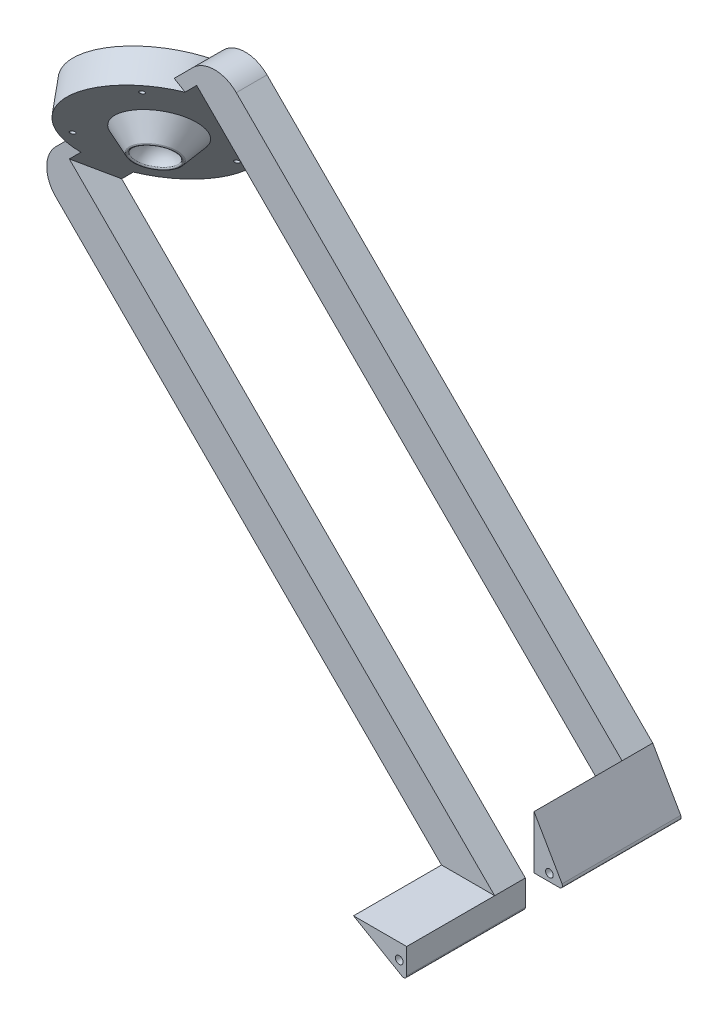
ISO-10303-21;
HEADER;
FILE_DESCRIPTION(('STEP AP214'),'2;1');
FILE_NAME('part.step','',(''),(''),'','','');
FILE_SCHEMA(('AUTOMOTIVE_DESIGN { 1 0 10303 214 1 1 1 1 }'));
ENDSEC;
DATA;
#1=APPLICATION_CONTEXT('core data for automotive mechanical design processes');
#2=APPLICATION_PROTOCOL_DEFINITION('international standard','automotive_design',2000,#1);
#3=PRODUCT_CONTEXT('',#1,'mechanical');
#4=PRODUCT('Part','Part','',(#3));
#5=PRODUCT_RELATED_PRODUCT_CATEGORY('part','',(#4));
#6=PRODUCT_DEFINITION_FORMATION('','',#4);
#7=PRODUCT_DEFINITION_CONTEXT('part definition',#1,'design');
#8=PRODUCT_DEFINITION('design','',#6,#7);
#9=PRODUCT_DEFINITION_SHAPE('','',#8);
#10=(LENGTH_UNIT() NAMED_UNIT(*) SI_UNIT(.MILLI.,.METRE.));
#11=(NAMED_UNIT(*) PLANE_ANGLE_UNIT() SI_UNIT($,.RADIAN.));
#12=(NAMED_UNIT(*) SI_UNIT($,.STERADIAN.) SOLID_ANGLE_UNIT());
#13=UNCERTAINTY_MEASURE_WITH_UNIT(LENGTH_MEASURE(1.E-05),#10,'distance_accuracy_value','');
#14=(GEOMETRIC_REPRESENTATION_CONTEXT(3) GLOBAL_UNCERTAINTY_ASSIGNED_CONTEXT((#13)) GLOBAL_UNIT_ASSIGNED_CONTEXT((#10,
#11,#12)) REPRESENTATION_CONTEXT('',''));
#15=CARTESIAN_POINT('',(0.,0.,0.));
#16=DIRECTION('',(0.,0.,1.));
#17=DIRECTION('',(1.,0.,0.));
#18=AXIS2_PLACEMENT_3D('',#15,#16,#17);
#19=CARTESIAN_POINT('',(-194.571356237309,153.071356237309,-43.6716));
#20=DIRECTION('',(0.707106781186548,-0.707106781186548,0.));
#21=DIRECTION('',(0.707106781186548,0.707106781186548,0.));
#22=AXIS2_PLACEMENT_3D('',#19,#20,#21);
#23=PLANE('',#22);
#24=DIRECTION('',(0.707106781186547,0.707106781186547,0.));
#25=VECTOR('',#24,1.);
#26=CARTESIAN_POINT('',(-194.571356237309,153.071356237309,-43.6716));
#27=LINE('',#26,#25);
#28=CARTESIAN_POINT('',(-196.160542463288,151.482170011331,-43.6716));
#29=VERTEX_POINT('',#28);
#30=CARTESIAN_POINT('',(-191.38552430756,156.257188167059,-43.6716));
#31=VERTEX_POINT('',#30);
#32=EDGE_CURVE('E283',#29,#31,#27,.T.);
#33=ORIENTED_EDGE('',*,*,#32,.F.);
#34=DIRECTION('',(0.,0.,1.));
#35=VECTOR('',#34,1.);
#36=CARTESIAN_POINT('',(-196.160542463288,151.482170011331,-43.6716));
#37=LINE('',#36,#35);
#38=CARTESIAN_POINT('',(-196.160542463288,151.482170011331,-33.6716));
#39=VERTEX_POINT('',#38);
#40=EDGE_CURVE('E361',#29,#39,#37,.T.);
#41=ORIENTED_EDGE('',*,*,#40,.T.);
#42=DIRECTION('',(0.707106781186547,0.707106781186547,0.));
#43=VECTOR('',#42,1.);
#44=CARTESIAN_POINT('',(-194.571356237309,153.071356237309,-33.6716));
#45=LINE('',#44,#43);
#46=CARTESIAN_POINT('',(-190.054039318057,157.588673156562,-33.6716));
#47=VERTEX_POINT('',#46);
#48=EDGE_CURVE('E292',#39,#47,#45,.T.);
#49=ORIENTED_EDGE('',*,*,#48,.T.);
#50=CARTESIAN_POINT('',(-173.821356237309,173.82135623731,-47.6716));
#51=DIRECTION('',(0.707106781186548,-0.707106781186548,0.));
#52=DIRECTION('',(0.,0.,1.));
#53=AXIS2_PLACEMENT_3D('',#50,#51,#52);
#54=ELLIPSE('',#53,35.3553390593275,25.);
#55=EDGE_CURVE('E226',#47,#31,#54,.T.);
#56=ORIENTED_EDGE('',*,*,#55,.T.);
#57=EDGE_LOOP('',(#33,#41,#49,#56));
#58=FACE_BOUND('',#57,.T.);
#59=ADVANCED_FACE('F41',(#58),#23,.F.);
#60=CARTESIAN_POINT('',(0.,0.,-43.6716));
#61=DIRECTION('',(0.,0.,-1.));
#62=DIRECTION('',(-1.,0.,0.));
#63=AXIS2_PLACEMENT_3D('',#60,#61,#62);
#64=PLANE('',#63);
#65=DIRECTION('',(-0.707106781186547,0.707106781186548,0.));
#66=VECTOR('',#65,1.);
#67=CARTESIAN_POINT('',(-203.231610275154,144.411102199465,-43.6716));
#68=LINE('',#67,#66);
#69=CARTESIAN_POINT('',(-70.4705080756887,11.65,-43.6716));
#70=VERTEX_POINT('',#69);
#71=CARTESIAN_POINT('',(-196.160542463288,137.3400343876,-43.6716));
#72=VERTEX_POINT('',#71);
#73=EDGE_CURVE('E279',#70,#72,#68,.T.);
#74=ORIENTED_EDGE('',*,*,#73,.T.);
#75=CARTESIAN_POINT('',(-189.089474651423,144.411102199465,-43.6716));
#76=DIRECTION('',(0.,0.,-1.));
#77=DIRECTION('',(-1.,0.,0.));
#78=AXIS2_PLACEMENT_3D('',#75,#76,#77);
#79=CIRCLE('',#78,10.);
#80=EDGE_CURVE('E11',#72,#29,#79,.T.);
#81=ORIENTED_EDGE('',*,*,#80,.T.);
#82=ORIENTED_EDGE('',*,*,#32,.T.);
#83=CARTESIAN_POINT('',(-170.992929112563,170.992929112563,-43.6716));
#84=DIRECTION('',(0.,0.,-1.));
#85=DIRECTION('',(0.707106781186548,-0.707106781186547,0.));
#86=AXIS2_PLACEMENT_3D('',#83,#84,#85);
#87=ELLIPSE('',#86,35.3553390593272,25.);
#88=CARTESIAN_POINT('',(-180.877686258511,146.966036342885,-43.6716));
#89=VERTEX_POINT('',#88);
#90=EDGE_CURVE('E229',#89,#31,#87,.T.);
#91=ORIENTED_EDGE('',*,*,#90,.F.);
#92=DIRECTION('',(0.707106781186547,0.707106781186547,0.));
#93=VECTOR('',#92,1.);
#94=CARTESIAN_POINT('',(-218.994343326126,108.84937927527,-43.6716));
#95=LINE('',#94,#93);
#96=CARTESIAN_POINT('',(-184.671861300698,143.171861300698,-43.6716));
#97=VERTEX_POINT('',#96);
#98=EDGE_CURVE('E234',#97,#89,#95,.T.);
#99=ORIENTED_EDGE('',*,*,#98,.F.);
#100=DIRECTION('',(0.707106781186547,-0.707106781186547,0.));
#101=VECTOR('',#100,1.);
#102=CARTESIAN_POINT('',(-53.15,11.65,-43.6716));
#103=LINE('',#102,#101);
#104=CARTESIAN_POINT('',(-53.15,11.65,-43.6716));
#105=VERTEX_POINT('',#104);
#106=EDGE_CURVE('E285',#97,#105,#103,.T.);
#107=ORIENTED_EDGE('',*,*,#106,.T.);
#108=DIRECTION('',(0.,-1.,0.));
#109=VECTOR('',#108,1.);
#110=CARTESIAN_POINT('',(-53.15,1.64999999999997,-43.6716));
#111=LINE('',#110,#109);
#112=CARTESIAN_POINT('',(-53.15,3.38205080756885,-43.6716));
#113=VERTEX_POINT('',#112);
#114=EDGE_CURVE('E287',#105,#113,#111,.T.);
#115=ORIENTED_EDGE('',*,*,#114,.T.);
#116=CARTESIAN_POINT('',(-54.15,3.38205080756885,-43.6716));
#117=DIRECTION('',(0.,0.,-1.));
#118=DIRECTION('',(-1.,0.,0.));
#119=AXIS2_PLACEMENT_3D('',#116,#117,#118);
#120=CIRCLE('',#119,1.);
#121=CARTESIAN_POINT('',(-54.65,2.51602540378442,-43.6716));
#122=VERTEX_POINT('',#121);
#123=EDGE_CURVE('E334',#113,#122,#120,.T.);
#124=ORIENTED_EDGE('',*,*,#123,.T.);
#125=DIRECTION('',(-0.866025403784438,0.5,0.));
#126=VECTOR('',#125,1.);
#127=CARTESIAN_POINT('',(-70.4705080756887,11.65,-43.6716));
#128=LINE('',#127,#126);
#129=EDGE_CURVE('E277',#122,#70,#128,.T.);
#130=ORIENTED_EDGE('',*,*,#129,.T.);
#131=EDGE_LOOP('',(#74,#81,#82,#91,#99,#107,#115,#124,#130));
#132=FACE_BOUND('',#131,.T.);
#133=ADVANCED_FACE('F374',(#132),#64,.T.);
#134=CARTESIAN_POINT('',(0.,0.,-33.6716));
#135=DIRECTION('',(0.,0.,-1.));
#136=DIRECTION('',(-1.,0.,0.));
#137=AXIS2_PLACEMENT_3D('',#134,#135,#136);
#138=PLANE('',#137);
#139=ORIENTED_EDGE('',*,*,#48,.F.);
#140=CARTESIAN_POINT('',(-189.089474651423,144.411102199465,-33.6716));
#141=DIRECTION('',(0.,0.,-1.));
#142=DIRECTION('',(-1.,0.,0.));
#143=AXIS2_PLACEMENT_3D('',#140,#141,#142);
#144=CIRCLE('',#143,10.);
#145=CARTESIAN_POINT('',(-196.160542463288,137.3400343876,-33.6716));
#146=VERTEX_POINT('',#145);
#147=EDGE_CURVE('E63',#39,#146,#144,.F.);
#148=ORIENTED_EDGE('',*,*,#147,.T.);
#149=DIRECTION('',(-0.707106781186547,0.707106781186548,0.));
#150=VECTOR('',#149,1.);
#151=CARTESIAN_POINT('',(-203.231610275154,144.411102199465,-33.6716));
#152=LINE('',#151,#150);
#153=CARTESIAN_POINT('',(-70.4705080756887,11.65,-33.6716));
#154=VERTEX_POINT('',#153);
#155=EDGE_CURVE('E276',#154,#146,#152,.T.);
#156=ORIENTED_EDGE('',*,*,#155,.F.);
#157=DIRECTION('',(-1.,0.,0.));
#158=VECTOR('',#157,1.);
#159=CARTESIAN_POINT('',(0.,11.65,-33.6716));
#160=LINE('',#159,#158);
#161=CARTESIAN_POINT('',(-53.15,11.65,-33.6716));
#162=VERTEX_POINT('',#161);
#163=EDGE_CURVE('E299',#162,#154,#160,.T.);
#164=ORIENTED_EDGE('',*,*,#163,.F.);
#165=DIRECTION('',(0.707106781186547,-0.707106781186547,0.));
#166=VECTOR('',#165,1.);
#167=CARTESIAN_POINT('',(-53.15,11.65,-33.6716));
#168=LINE('',#167,#166);
#169=CARTESIAN_POINT('',(-191.742929112563,150.242929112563,-33.6716));
#170=VERTEX_POINT('',#169);
#171=EDGE_CURVE('E280',#170,#162,#168,.T.);
#172=ORIENTED_EDGE('',*,*,#171,.F.);
#173=DIRECTION('',(0.707106781186547,0.707106781186547,0.));
#174=VECTOR('',#173,1.);
#175=CARTESIAN_POINT('',(-226.065411137991,115.920447087135,-33.6716));
#176=LINE('',#175,#174);
#177=CARTESIAN_POINT('',(-187.948754070376,154.03710415475,-33.6716));
#178=VERTEX_POINT('',#177);
#179=EDGE_CURVE('E195',#170,#178,#176,.T.);
#180=ORIENTED_EDGE('',*,*,#179,.T.);
#181=CARTESIAN_POINT('',(-163.921861300698,163.921861300698,-33.6716));
#182=DIRECTION('',(0.,0.,-1.));
#183=DIRECTION('',(0.707106781186548,-0.707106781186547,0.));
#184=AXIS2_PLACEMENT_3D('',#181,#182,#183);
#185=ELLIPSE('',#184,35.3553390593272,25.);
#186=EDGE_CURVE('E210',#178,#47,#185,.T.);
#187=ORIENTED_EDGE('',*,*,#186,.T.);
#188=EDGE_LOOP('',(#139,#148,#156,#164,#172,#180,#187));
#189=FACE_BOUND('',#188,.T.);
#190=ADVANCED_FACE('F370',(#189),#138,.F.);
#191=CARTESIAN_POINT('',(0.971953032018379,-53.15,-5.));
#192=DIRECTION('',(0.,0.,-1.));
#193=DIRECTION('',(-1.,0.,0.));
#194=AXIS2_PLACEMENT_3D('',#191,#192,#193);
#195=PLANE('',#194);
#196=CARTESIAN_POINT('',(-55.575,6.64999999999998,-5.00000000000001));
#197=DIRECTION('',(0.,0.,-1.));
#198=DIRECTION('',(-1.,0.,0.));
#199=AXIS2_PLACEMENT_3D('',#196,#197,#198);
#200=CIRCLE('',#199,1.24999999999999);
#201=CARTESIAN_POINT('',(-56.825,6.64999999999998,-5.00000000000001));
#202=VERTEX_POINT('',#201);
#203=EDGE_CURVE('E315',#202,#202,#200,.F.);
#204=ORIENTED_EDGE('',*,*,#203,.F.);
#205=EDGE_LOOP('',(#204));
#206=FACE_BOUND('',#205,.T.);
#207=DIRECTION('',(0.866025403784439,-0.5,0.));
#208=VECTOR('',#207,1.);
#209=CARTESIAN_POINT('',(-12.5730290418779,-21.7771251055715,-5.));
#210=LINE('',#209,#208);
#211=CARTESIAN_POINT('',(-70.4705080756887,11.65,-5.));
#212=VERTEX_POINT('',#211);
#213=CARTESIAN_POINT('',(-54.65,2.51602540378442,-5.));
#214=VERTEX_POINT('',#213);
#215=EDGE_CURVE('E311',#212,#214,#210,.T.);
#216=ORIENTED_EDGE('',*,*,#215,.T.);
#217=CARTESIAN_POINT('',(-54.15,3.38205080756885,-5.));
#218=DIRECTION('',(0.,0.,-1.));
#219=DIRECTION('',(-1.,0.,0.));
#220=AXIS2_PLACEMENT_3D('',#217,#218,#219);
#221=CIRCLE('',#220,1.);
#222=CARTESIAN_POINT('',(-53.15,3.38205080756886,-5.));
#223=VERTEX_POINT('',#222);
#224=EDGE_CURVE('E328',#214,#223,#221,.F.);
#225=ORIENTED_EDGE('',*,*,#224,.T.);
#226=DIRECTION('',(0.,-1.,0.));
#227=VECTOR('',#226,1.);
#228=CARTESIAN_POINT('',(-53.15,-41.65,-5.));
#229=LINE('',#228,#227);
#230=CARTESIAN_POINT('',(-53.15,11.65,-5.));
#231=VERTEX_POINT('',#230);
#232=EDGE_CURVE('E312',#231,#223,#229,.T.);
#233=ORIENTED_EDGE('',*,*,#232,.F.);
#234=DIRECTION('',(-1.,0.,0.));
#235=VECTOR('',#234,1.);
#236=CARTESIAN_POINT('',(0.,11.65,-5.));
#237=LINE('',#236,#235);
#238=EDGE_CURVE('E318',#231,#212,#237,.T.);
#239=ORIENTED_EDGE('',*,*,#238,.T.);
#240=EDGE_LOOP('',(#216,#225,#233,#239));
#241=FACE_BOUND('',#240,.T.);
#242=ADVANCED_FACE('F393',(#206,#241),#195,.F.);
#243=DIRECTION('',(-1.,0.,0.));
#244=VECTOR('',#243,1.);
#245=CARTESIAN_POINT('',(-41.65,53.15,-5.));
#246=LINE('',#245,#244);
#247=CARTESIAN_POINT('',(-3.38205080756888,53.15,-5.));
#248=VERTEX_POINT('',#247);
#249=CARTESIAN_POINT('',(-11.65,53.15,-5.));
#250=VERTEX_POINT('',#249);
#251=EDGE_CURVE('E309',#248,#250,#246,.T.);
#252=ORIENTED_EDGE('',*,*,#251,.F.);
#253=CARTESIAN_POINT('',(-3.38205080756888,54.15,-5.));
#254=DIRECTION('',(0.,0.,-1.));
#255=DIRECTION('',(-1.,0.,0.));
#256=AXIS2_PLACEMENT_3D('',#253,#254,#255);
#257=CIRCLE('',#256,1.);
#258=CARTESIAN_POINT('',(-2.51602540378444,54.65,-5.));
#259=VERTEX_POINT('',#258);
#260=EDGE_CURVE('E339',#248,#259,#257,.F.);
#261=ORIENTED_EDGE('',*,*,#260,.T.);
#262=DIRECTION('',(0.5,-0.866025403784438,0.));
#263=VECTOR('',#262,1.);
#264=CARTESIAN_POINT('',(21.7771251055715,12.5730290418779,-5.));
#265=LINE('',#264,#263);
#266=CARTESIAN_POINT('',(-11.65,70.4705080756887,-5.));
#267=VERTEX_POINT('',#266);
#268=EDGE_CURVE('E264',#267,#259,#265,.T.);
#269=ORIENTED_EDGE('',*,*,#268,.F.);
#270=DIRECTION('',(0.,1.,0.));
#271=VECTOR('',#270,1.);
#272=CARTESIAN_POINT('',(-11.65,0.,-5.));
#273=LINE('',#272,#271);
#274=EDGE_CURVE('E259',#250,#267,#273,.T.);
#275=ORIENTED_EDGE('',*,*,#274,.F.);
#276=EDGE_LOOP('',(#252,#261,#269,#275));
#277=FACE_BOUND('',#276,.T.);
#278=CARTESIAN_POINT('',(-6.64999999999999,55.575,-5.00000000000001));
#279=DIRECTION('',(0.,0.,-1.));
#280=DIRECTION('',(-1.,0.,0.));
#281=AXIS2_PLACEMENT_3D('',#278,#279,#280);
#282=CIRCLE('',#281,1.24999999999999);
#283=CARTESIAN_POINT('',(-7.89999999999997,55.575,-5.00000000000001));
#284=VERTEX_POINT('',#283);
#285=EDGE_CURVE('E308',#284,#284,#282,.F.);
#286=ORIENTED_EDGE('',*,*,#285,.F.);
#287=EDGE_LOOP('',(#286));
#288=FACE_BOUND('',#287,.T.);
#289=ADVANCED_FACE('F457',(#277,#288),#195,.F.);
#290=CARTESIAN_POINT('',(-6.64999999999999,55.575,-24.81));
#291=DIRECTION('',(0.,0.,1.));
#292=DIRECTION('',(1.,0.,0.));
#293=AXIS2_PLACEMENT_3D('',#290,#291,#292);
#294=CONICAL_SURFACE('',#293,1.24999999999998,1.02974425867665);
#295=CARTESIAN_POINT('',(-6.65,55.575,-25.5610757737844));
#296=VERTEX_POINT('',#295);
#297=VERTEX_LOOP('',#296);
#298=FACE_BOUND('',#297,.T.);
#299=CARTESIAN_POINT('',(-6.64999999999999,55.575,-24.81));
#300=DIRECTION('',(0.,0.,1.));
#301=DIRECTION('',(1.,0.,0.));
#302=AXIS2_PLACEMENT_3D('',#299,#300,#301);
#303=CIRCLE('',#302,1.24999999999998);
#304=CARTESIAN_POINT('',(-5.4,55.575,-24.81));
#305=VERTEX_POINT('',#304);
#306=EDGE_CURVE('E236',#305,#305,#303,.T.);
#307=ORIENTED_EDGE('',*,*,#306,.T.);
#308=EDGE_LOOP('',(#307));
#309=FACE_BOUND('',#308,.T.);
#310=ADVANCED_FACE('F496',(#298,#309),#294,.F.);
#311=CARTESIAN_POINT('',(-6.64999999999999,55.575,5.));
#312=DIRECTION('',(0.,0.,1.));
#313=DIRECTION('',(1.,0.,0.));
#314=AXIS2_PLACEMENT_3D('',#311,#312,#313);
#315=CYLINDRICAL_SURFACE('',#314,1.24999999999999);
#316=ORIENTED_EDGE('',*,*,#285,.T.);
#317=EDGE_LOOP('',(#316));
#318=FACE_BOUND('',#317,.T.);
#319=ORIENTED_EDGE('',*,*,#306,.F.);
#320=EDGE_LOOP('',(#319));
#321=FACE_BOUND('',#320,.T.);
#322=ADVANCED_FACE('F408',(#318,#321),#315,.F.);
#323=CARTESIAN_POINT('',(-41.65,53.15,-155.33090168026));
#324=DIRECTION('',(0.,1.,0.));
#325=DIRECTION('',(0.,0.,1.));
#326=AXIS2_PLACEMENT_3D('',#323,#324,#325);
#327=PLANE('',#326);
#328=DIRECTION('',(1.,0.,0.));
#329=VECTOR('',#328,1.);
#330=CARTESIAN_POINT('',(-1.64999999999998,53.15,-43.6716));
#331=LINE('',#330,#329);
#332=CARTESIAN_POINT('',(-11.65,53.15,-43.6716));
#333=VERTEX_POINT('',#332);
#334=CARTESIAN_POINT('',(-3.38205080756888,53.15,-43.6716));
#335=VERTEX_POINT('',#334);
#336=EDGE_CURVE('E242',#333,#335,#331,.T.);
#337=ORIENTED_EDGE('',*,*,#336,.T.);
#338=DIRECTION('',(0.,0.,1.));
#339=VECTOR('',#338,1.);
#340=CARTESIAN_POINT('',(-3.38205080756888,53.15,-155.33090168026));
#341=LINE('',#340,#339);
#342=EDGE_CURVE('E336',#335,#248,#341,.T.);
#343=ORIENTED_EDGE('',*,*,#342,.T.);
#344=ORIENTED_EDGE('',*,*,#251,.T.);
#345=DIRECTION('',(0.,0.,1.));
#346=VECTOR('',#345,1.);
#347=CARTESIAN_POINT('',(-11.65,53.15,-33.6716));
#348=LINE('',#347,#346);
#349=CARTESIAN_POINT('',(-11.65,53.15,-33.6716));
#350=VERTEX_POINT('',#349);
#351=EDGE_CURVE('E263',#350,#250,#348,.T.);
#352=ORIENTED_EDGE('',*,*,#351,.F.);
#353=DIRECTION('',(0.,0.,1.));
#354=VECTOR('',#353,1.);
#355=CARTESIAN_POINT('',(-11.65,53.15,-43.6716));
#356=LINE('',#355,#354);
#357=EDGE_CURVE('E256',#333,#350,#356,.T.);
#358=ORIENTED_EDGE('',*,*,#357,.F.);
#359=EDGE_LOOP('',(#337,#343,#344,#352,#358));
#360=FACE_BOUND('',#359,.T.);
#361=ADVANCED_FACE('F401',(#360),#327,.F.);
#362=CARTESIAN_POINT('',(-53.15,-41.65,-155.33090168026));
#363=DIRECTION('',(-1.,0.,0.));
#364=DIRECTION('',(0.,0.,1.));
#365=AXIS2_PLACEMENT_3D('',#362,#363,#364);
#366=PLANE('',#365);
#367=ORIENTED_EDGE('',*,*,#232,.T.);
#368=DIRECTION('',(0.,0.,1.));
#369=VECTOR('',#368,1.);
#370=CARTESIAN_POINT('',(-53.15,3.38205080756885,-43.6716));
#371=LINE('',#370,#369);
#372=EDGE_CURVE('E330',#223,#113,#371,.F.);
#373=ORIENTED_EDGE('',*,*,#372,.T.);
#374=ORIENTED_EDGE('',*,*,#114,.F.);
#375=DIRECTION('',(0.,0.,1.));
#376=VECTOR('',#375,1.);
#377=CARTESIAN_POINT('',(-53.15,11.65,-43.6716));
#378=LINE('',#377,#376);
#379=EDGE_CURVE('E290',#105,#162,#378,.T.);
#380=ORIENTED_EDGE('',*,*,#379,.T.);
#381=DIRECTION('',(0.,0.,1.));
#382=VECTOR('',#381,1.);
#383=CARTESIAN_POINT('',(-53.15,11.65,-33.6716));
#384=LINE('',#383,#382);
#385=EDGE_CURVE('E302',#162,#231,#384,.T.);
#386=ORIENTED_EDGE('',*,*,#385,.T.);
#387=EDGE_LOOP('',(#367,#373,#374,#380,#386));
#388=FACE_BOUND('',#387,.T.);
#389=ADVANCED_FACE('F399',(#388),#366,.F.);
#390=CARTESIAN_POINT('',(-12.5730290418779,-21.7771251055715,-33.6716));
#391=DIRECTION('',(-0.5,-0.866025403784438,0.));
#392=DIRECTION('',(0.866025403784439,-0.5,0.));
#393=AXIS2_PLACEMENT_3D('',#390,#391,#392);
#394=PLANE('',#393);
#395=ORIENTED_EDGE('',*,*,#129,.F.);
#396=DIRECTION('',(0.,0.,1.));
#397=VECTOR('',#396,1.);
#398=CARTESIAN_POINT('',(-54.65,2.51602540378441,-5.));
#399=LINE('',#398,#397);
#400=EDGE_CURVE('E321',#122,#214,#399,.T.);
#401=ORIENTED_EDGE('',*,*,#400,.T.);
#402=ORIENTED_EDGE('',*,*,#215,.F.);
#403=DIRECTION('',(0.,0.,1.));
#404=VECTOR('',#403,1.);
#405=CARTESIAN_POINT('',(-70.4705080756887,11.65,-33.6716));
#406=LINE('',#405,#404);
#407=EDGE_CURVE('E305',#154,#212,#406,.T.);
#408=ORIENTED_EDGE('',*,*,#407,.F.);
#409=DIRECTION('',(0.,0.,1.));
#410=VECTOR('',#409,1.);
#411=CARTESIAN_POINT('',(-70.4705080756887,11.65,-43.6716));
#412=LINE('',#411,#410);
#413=EDGE_CURVE('E297',#70,#154,#412,.T.);
#414=ORIENTED_EDGE('',*,*,#413,.F.);
#415=EDGE_LOOP('',(#395,#401,#402,#408,#414));
#416=FACE_BOUND('',#415,.T.);
#417=ADVANCED_FACE('F389',(#416),#394,.T.);
#418=CARTESIAN_POINT('',(0.,11.65,-33.6716));
#419=DIRECTION('',(0.,1.,0.));
#420=DIRECTION('',(-1.,0.,0.));
#421=AXIS2_PLACEMENT_3D('',#418,#419,#420);
#422=PLANE('',#421);
#423=ORIENTED_EDGE('',*,*,#238,.F.);
#424=ORIENTED_EDGE('',*,*,#385,.F.);
#425=ORIENTED_EDGE('',*,*,#163,.T.);
#426=ORIENTED_EDGE('',*,*,#407,.T.);
#427=EDGE_LOOP('',(#423,#424,#425,#426));
#428=FACE_BOUND('',#427,.T.);
#429=ADVANCED_FACE('F397',(#428),#422,.T.);
#430=CARTESIAN_POINT('',(-203.231610275154,144.411102199465,-43.6716));
#431=DIRECTION('',(0.707106781186548,0.707106781186547,0.));
#432=DIRECTION('',(-0.707106781186547,0.707106781186548,0.));
#433=AXIS2_PLACEMENT_3D('',#430,#431,#432);
#434=PLANE('',#433);
#435=ORIENTED_EDGE('',*,*,#155,.T.);
#436=DIRECTION('',(0.,0.,1.));
#437=VECTOR('',#436,1.);
#438=CARTESIAN_POINT('',(-196.160542463288,137.3400343876,-43.6716));
#439=LINE('',#438,#437);
#440=EDGE_CURVE('E49',#146,#72,#439,.F.);
#441=ORIENTED_EDGE('',*,*,#440,.T.);
#442=ORIENTED_EDGE('',*,*,#73,.F.);
#443=ORIENTED_EDGE('',*,*,#413,.T.);
#444=EDGE_LOOP('',(#435,#441,#442,#443));
#445=FACE_BOUND('',#444,.T.);
#446=ADVANCED_FACE('F398',(#445),#434,.F.);
#447=CARTESIAN_POINT('',(-157.588673156562,190.054039318057,-33.6716));
#448=VERTEX_POINT('',#447);
#449=CARTESIAN_POINT('',(-151.482170011331,196.160542463288,-33.6716));
#450=VERTEX_POINT('',#449);
#451=EDGE_CURVE('E204',#448,#450,#45,.T.);
#452=ORIENTED_EDGE('',*,*,#451,.T.);
#453=DIRECTION('',(0.,0.,1.));
#454=VECTOR('',#453,1.);
#455=CARTESIAN_POINT('',(-151.482170011331,196.160542463288,-43.6716));
#456=LINE('',#455,#454);
#457=CARTESIAN_POINT('',(-151.482170011331,196.160542463288,-43.6716));
#458=VERTEX_POINT('',#457);
#459=EDGE_CURVE('E357',#450,#458,#456,.F.);
#460=ORIENTED_EDGE('',*,*,#459,.T.);
#461=CARTESIAN_POINT('',(-156.257188167059,191.38552430756,-43.6716));
#462=VERTEX_POINT('',#461);
#463=EDGE_CURVE('E282',#462,#458,#27,.T.);
#464=ORIENTED_EDGE('',*,*,#463,.F.);
#465=EDGE_CURVE('E207',#462,#448,#54,.T.);
#466=ORIENTED_EDGE('',*,*,#465,.T.);
#467=EDGE_LOOP('',(#452,#460,#464,#466));
#468=FACE_BOUND('',#467,.T.);
#469=ADVANCED_FACE('F415',(#468),#23,.F.);
#470=CARTESIAN_POINT('',(-53.15,11.65,-43.6716));
#471=DIRECTION('',(-0.707106781186548,-0.707106781186548,0.));
#472=DIRECTION('',(0.707106781186548,-0.707106781186548,0.));
#473=AXIS2_PLACEMENT_3D('',#470,#471,#472);
#474=PLANE('',#473);
#475=ORIENTED_EDGE('',*,*,#106,.F.);
#476=DIRECTION('',(0.500000000000002,-0.500000000000002,-0.707106781186545));
#477=VECTOR('',#476,1.);
#478=CARTESIAN_POINT('',(-118.151172902981,76.6511729029815,-137.746059710444));
#479=LINE('',#478,#477);
#480=EDGE_CURVE('E196',#170,#97,#479,.T.);
#481=ORIENTED_EDGE('',*,*,#480,.F.);
#482=ORIENTED_EDGE('',*,*,#171,.T.);
#483=ORIENTED_EDGE('',*,*,#379,.F.);
#484=EDGE_LOOP('',(#475,#481,#482,#483));
#485=FACE_BOUND('',#484,.T.);
#486=ADVANCED_FACE('F377',(#485),#474,.F.);
#487=ORIENTED_EDGE('',*,*,#463,.T.);
#488=CARTESIAN_POINT('',(-144.411102199465,189.089474651423,-43.6716));
#489=DIRECTION('',(0.,0.,-1.));
#490=DIRECTION('',(-1.,0.,0.));
#491=AXIS2_PLACEMENT_3D('',#488,#489,#490);
#492=CIRCLE('',#491,10.);
#493=CARTESIAN_POINT('',(-137.3400343876,196.160542463288,-43.6716));
#494=VERTEX_POINT('',#493);
#495=EDGE_CURVE('E359',#458,#494,#492,.T.);
#496=ORIENTED_EDGE('',*,*,#495,.T.);
#497=DIRECTION('',(-0.707106781186548,0.707106781186547,0.));
#498=VECTOR('',#497,1.);
#499=CARTESIAN_POINT('',(-144.411102199465,203.231610275154,-43.6716));
#500=LINE('',#499,#498);
#501=CARTESIAN_POINT('',(-11.65,70.4705080756887,-43.6716));
#502=VERTEX_POINT('',#501);
#503=EDGE_CURVE('E248',#502,#494,#500,.T.);
#504=ORIENTED_EDGE('',*,*,#503,.F.);
#505=DIRECTION('',(-0.500000000000001,0.866025403784438,0.));
#506=VECTOR('',#505,1.);
#507=CARTESIAN_POINT('',(-11.65,70.4705080756887,-43.6716));
#508=LINE('',#507,#506);
#509=CARTESIAN_POINT('',(-2.51602540378444,54.65,-43.6716));
#510=VERTEX_POINT('',#509);
#511=EDGE_CURVE('E240',#510,#502,#508,.T.);
#512=ORIENTED_EDGE('',*,*,#511,.F.);
#513=CARTESIAN_POINT('',(-3.38205080756888,54.15,-43.6716));
#514=DIRECTION('',(0.,0.,-1.));
#515=DIRECTION('',(-1.,0.,0.));
#516=AXIS2_PLACEMENT_3D('',#513,#514,#515);
#517=CIRCLE('',#516,1.);
#518=EDGE_CURVE('E332',#510,#335,#517,.T.);
#519=ORIENTED_EDGE('',*,*,#518,.T.);
#520=ORIENTED_EDGE('',*,*,#336,.F.);
#521=DIRECTION('',(0.707106781186548,-0.707106781186547,0.));
#522=VECTOR('',#521,1.);
#523=CARTESIAN_POINT('',(-11.65,53.15,-43.6716));
#524=LINE('',#523,#522);
#525=CARTESIAN_POINT('',(-143.171861300698,184.671861300698,-43.6716));
#526=VERTEX_POINT('',#525);
#527=EDGE_CURVE('E246',#526,#333,#524,.T.);
#528=ORIENTED_EDGE('',*,*,#527,.F.);
#529=CARTESIAN_POINT('',(-146.966036342885,180.877686258511,-43.6716));
#530=VERTEX_POINT('',#529);
#531=EDGE_CURVE('E233',#530,#526,#95,.T.);
#532=ORIENTED_EDGE('',*,*,#531,.F.);
#533=EDGE_CURVE('E225',#462,#530,#87,.T.);
#534=ORIENTED_EDGE('',*,*,#533,.F.);
#535=EDGE_LOOP('',(#487,#496,#504,#512,#519,#520,#528,#532,#534));
#536=FACE_BOUND('',#535,.T.);
#537=ADVANCED_FACE('F420',(#536),#64,.T.);
#538=DIRECTION('',(-0.707106781186548,0.707106781186547,0.));
#539=VECTOR('',#538,1.);
#540=CARTESIAN_POINT('',(-144.411102199465,203.231610275154,-33.6716));
#541=LINE('',#540,#539);
#542=CARTESIAN_POINT('',(-11.65,70.4705080756887,-33.6716));
#543=VERTEX_POINT('',#542);
#544=CARTESIAN_POINT('',(-137.3400343876,196.160542463288,-33.6716));
#545=VERTEX_POINT('',#544);
#546=EDGE_CURVE('E243',#543,#545,#541,.T.);
#547=ORIENTED_EDGE('',*,*,#546,.T.);
#548=CARTESIAN_POINT('',(-144.411102199465,189.089474651423,-33.6716));
#549=DIRECTION('',(0.,0.,-1.));
#550=DIRECTION('',(-1.,0.,0.));
#551=AXIS2_PLACEMENT_3D('',#548,#549,#550);
#552=CIRCLE('',#551,10.);
#553=EDGE_CURVE('E355',#545,#450,#552,.F.);
#554=ORIENTED_EDGE('',*,*,#553,.T.);
#555=ORIENTED_EDGE('',*,*,#451,.F.);
#556=CARTESIAN_POINT('',(-154.03710415475,187.948754070377,-33.6716000000001));
#557=VERTEX_POINT('',#556);
#558=EDGE_CURVE('E200',#448,#557,#185,.T.);
#559=ORIENTED_EDGE('',*,*,#558,.T.);
#560=CARTESIAN_POINT('',(-150.242929112563,191.742929112563,-33.6716));
#561=VERTEX_POINT('',#560);
#562=EDGE_CURVE('E184',#557,#561,#176,.T.);
#563=ORIENTED_EDGE('',*,*,#562,.T.);
#564=DIRECTION('',(0.707106781186548,-0.707106781186547,0.));
#565=VECTOR('',#564,1.);
#566=CARTESIAN_POINT('',(-11.65,53.15,-33.6716));
#567=LINE('',#566,#565);
#568=EDGE_CURVE('E239',#561,#350,#567,.T.);
#569=ORIENTED_EDGE('',*,*,#568,.T.);
#570=DIRECTION('',(0.,1.,0.));
#571=VECTOR('',#570,1.);
#572=CARTESIAN_POINT('',(-11.65,0.,-33.6716));
#573=LINE('',#572,#571);
#574=EDGE_CURVE('E260',#350,#543,#573,.T.);
#575=ORIENTED_EDGE('',*,*,#574,.T.);
#576=EDGE_LOOP('',(#547,#554,#555,#559,#563,#569,#575));
#577=FACE_BOUND('',#576,.T.);
#578=ADVANCED_FACE('F202',(#577),#138,.F.);
#579=CARTESIAN_POINT('',(-11.65,70.4705080756887,25.));
#580=DIRECTION('',(1.,0.,0.));
#581=DIRECTION('',(0.,0.,-1.));
#582=AXIS2_PLACEMENT_3D('',#579,#580,#581);
#583=PLANE('',#582);
#584=ORIENTED_EDGE('',*,*,#274,.T.);
#585=DIRECTION('',(0.,0.,-1.));
#586=VECTOR('',#585,1.);
#587=CARTESIAN_POINT('',(-11.65,70.4705080756887,25.));
#588=LINE('',#587,#586);
#589=EDGE_CURVE('E274',#267,#543,#588,.T.);
#590=ORIENTED_EDGE('',*,*,#589,.T.);
#591=ORIENTED_EDGE('',*,*,#574,.F.);
#592=ORIENTED_EDGE('',*,*,#351,.T.);
#593=EDGE_LOOP('',(#584,#590,#591,#592));
#594=FACE_BOUND('',#593,.T.);
#595=ADVANCED_FACE('F461',(#594),#583,.F.);
#596=CARTESIAN_POINT('',(-11.65,70.4705080756887,25.));
#597=DIRECTION('',(-0.866025403784438,-0.5,0.));
#598=DIRECTION('',(0.5,-0.866025403784439,0.));
#599=AXIS2_PLACEMENT_3D('',#596,#597,#598);
#600=PLANE('',#599);
#601=ORIENTED_EDGE('',*,*,#268,.T.);
#602=DIRECTION('',(0.,0.,1.));
#603=VECTOR('',#602,1.);
#604=CARTESIAN_POINT('',(-2.51602540378444,54.65,25.));
#605=LINE('',#604,#603);
#606=EDGE_CURVE('E341',#259,#510,#605,.F.);
#607=ORIENTED_EDGE('',*,*,#606,.T.);
#608=ORIENTED_EDGE('',*,*,#511,.T.);
#609=DIRECTION('',(0.,0.,1.));
#610=VECTOR('',#609,1.);
#611=CARTESIAN_POINT('',(-11.65,70.4705080756887,-43.6716));
#612=LINE('',#611,#610);
#613=EDGE_CURVE('E251',#502,#543,#612,.T.);
#614=ORIENTED_EDGE('',*,*,#613,.T.);
#615=ORIENTED_EDGE('',*,*,#589,.F.);
#616=EDGE_LOOP('',(#601,#607,#608,#614,#615));
#617=FACE_BOUND('',#616,.T.);
#618=ADVANCED_FACE('F445',(#617),#600,.F.);
#619=CARTESIAN_POINT('',(-11.65,53.15,-43.6716));
#620=DIRECTION('',(-0.707106781186547,-0.707106781186548,0.));
#621=DIRECTION('',(0.707106781186548,-0.707106781186547,0.));
#622=AXIS2_PLACEMENT_3D('',#619,#620,#621);
#623=PLANE('',#622);
#624=DIRECTION('',(-0.500000000000002,0.500000000000002,0.707106781186545));
#625=VECTOR('',#624,1.);
#626=CARTESIAN_POINT('',(-76.6511729029815,118.151172902981,-137.746059710444));
#627=LINE('',#626,#625);
#628=EDGE_CURVE('E192',#526,#561,#627,.T.);
#629=ORIENTED_EDGE('',*,*,#628,.F.);
#630=ORIENTED_EDGE('',*,*,#527,.T.);
#631=ORIENTED_EDGE('',*,*,#357,.T.);
#632=ORIENTED_EDGE('',*,*,#568,.F.);
#633=EDGE_LOOP('',(#629,#630,#631,#632));
#634=FACE_BOUND('',#633,.T.);
#635=ADVANCED_FACE('F463',(#634),#623,.T.);
#636=CARTESIAN_POINT('',(-144.411102199465,203.231610275154,-43.6716));
#637=DIRECTION('',(0.707106781186547,0.707106781186548,0.));
#638=DIRECTION('',(-0.707106781186548,0.707106781186547,0.));
#639=AXIS2_PLACEMENT_3D('',#636,#637,#638);
#640=PLANE('',#639);
#641=ORIENTED_EDGE('',*,*,#503,.T.);
#642=DIRECTION('',(0.,0.,1.));
#643=VECTOR('',#642,1.);
#644=CARTESIAN_POINT('',(-137.3400343876,196.160542463288,-33.6716));
#645=LINE('',#644,#643);
#646=EDGE_CURVE('E352',#494,#545,#645,.T.);
#647=ORIENTED_EDGE('',*,*,#646,.T.);
#648=ORIENTED_EDGE('',*,*,#546,.F.);
#649=ORIENTED_EDGE('',*,*,#613,.F.);
#650=EDGE_LOOP('',(#641,#647,#648,#649));
#651=FACE_BOUND('',#650,.T.);
#652=ADVANCED_FACE('F441',(#651),#640,.T.);
#653=CARTESIAN_POINT('',(-152.473654928409,42.3286908775535,-137.746059710444));
#654=DIRECTION('',(0.499999999999998,-0.499999999999998,0.70710678118655));
#655=DIRECTION('',(0.816496580927728,0.,-0.577350269189623));
#656=AXIS2_PLACEMENT_3D('',#653,#654,#655);
#657=PLANE('',#656);
#658=CARTESIAN_POINT('',(-163.143686707646,185.771103705615,-28.7721050633885));
#659=DIRECTION('',(0.499999999999998,-0.499999999999997,0.707106781186551));
#660=DIRECTION('',(0.816496580927729,0.,-0.577350269189622));
#661=AXIS2_PLACEMENT_3D('',#658,#659,#660);
#662=CIRCLE('',#661,0.799999999999982);
#663=CARTESIAN_POINT('',(-162.490489442904,185.771103705615,-29.2339852787402));
#664=VERTEX_POINT('',#663);
#665=EDGE_CURVE('E894',#664,#664,#662,.T.);
#666=ORIENTED_EDGE('',*,*,#665,.F.);
#667=EDGE_LOOP('',(#666));
#668=FACE_BOUND('',#667,.T.);
#669=CARTESIAN_POINT('',(-185.771103705615,163.143686707646,-28.7721050633885));
#670=DIRECTION('',(0.499999999999998,-0.499999999999997,0.707106781186551));
#671=DIRECTION('',(0.816496580927729,0.,-0.577350269189622));
#672=AXIS2_PLACEMENT_3D('',#669,#670,#671);
#673=CIRCLE('',#672,0.799999999999982);
#674=CARTESIAN_POINT('',(-185.117906440873,163.143686707646,-29.2339852787402));
#675=VERTEX_POINT('',#674);
#676=EDGE_CURVE('E898',#675,#675,#673,.T.);
#677=ORIENTED_EDGE('',*,*,#676,.F.);
#678=EDGE_LOOP('',(#677));
#679=FACE_BOUND('',#678,.T.);
#680=CARTESIAN_POINT('',(-156.957395206631,156.957395206631,-53.5208424049175));
#681=DIRECTION('',(0.499999999999998,-0.499999999999997,0.707106781186551));
#682=DIRECTION('',(0.816496580927729,0.,-0.577350269189622));
#683=AXIS2_PLACEMENT_3D('',#680,#681,#682);
#684=CIRCLE('',#683,0.799999999999982);
#685=CARTESIAN_POINT('',(-156.304197941888,156.957395206631,-53.9827226202692));
#686=VERTEX_POINT('',#685);
#687=EDGE_CURVE('E902',#686,#686,#684,.T.);
#688=ORIENTED_EDGE('',*,*,#687,.F.);
#689=EDGE_LOOP('',(#688));
#690=FACE_BOUND('',#689,.T.);
#691=CARTESIAN_POINT('',(-167.457395206631,167.457395206631,-38.6716));
#692=DIRECTION('',(0.499999999999998,-0.499999999999998,0.70710678118655));
#693=DIRECTION('',(0.816496580927728,0.,-0.577350269189623));
#694=AXIS2_PLACEMENT_3D('',#691,#692,#693);
#695=CIRCLE('',#694,11.9999999999998);
#696=CARTESIAN_POINT('',(-157.659436235498,167.457395206631,-45.5998032302753));
#697=VERTEX_POINT('',#696);
#698=EDGE_CURVE('E343',#697,#697,#695,.T.);
#699=ORIENTED_EDGE('',*,*,#698,.F.);
#700=EDGE_LOOP('',(#699));
#701=FACE_BOUND('',#700,.T.);
#702=ORIENTED_EDGE('',*,*,#98,.T.);
#703=CARTESIAN_POINT('',(-167.457395206631,167.457395206631,-38.6716000000001));
#704=DIRECTION('',(0.499999999999997,-0.499999999999997,0.707106781186551));
#705=DIRECTION('',(0.816496580927729,0.,-0.577350269189622));
#706=AXIS2_PLACEMENT_3D('',#703,#704,#705);
#707=CIRCLE('',#706,25.);
#708=EDGE_CURVE('E216',#89,#530,#707,.T.);
#709=ORIENTED_EDGE('',*,*,#708,.T.);
#710=ORIENTED_EDGE('',*,*,#531,.T.);
#711=ORIENTED_EDGE('',*,*,#628,.T.);
#712=ORIENTED_EDGE('',*,*,#562,.F.);
#713=EDGE_CURVE('E190',#557,#178,#707,.T.);
#714=ORIENTED_EDGE('',*,*,#713,.T.);
#715=ORIENTED_EDGE('',*,*,#179,.F.);
#716=ORIENTED_EDGE('',*,*,#480,.T.);
#717=EDGE_LOOP('',(#702,#709,#710,#711,#712,#714,#715,#716));
#718=FACE_BOUND('',#717,.T.);
#719=ADVANCED_FACE('F187',(#668,#679,#690,#701,#718),#657,.T.);
#720=CARTESIAN_POINT('',(-55.575,6.64999999999998,-24.81));
#721=DIRECTION('',(0.,0.,1.));
#722=DIRECTION('',(1.,0.,0.));
#723=AXIS2_PLACEMENT_3D('',#720,#721,#722);
#724=CONICAL_SURFACE('',#723,1.24999999999999,1.02974425867665);
#725=CARTESIAN_POINT('',(-55.575,6.64999999999998,-25.5610757737844));
#726=VERTEX_POINT('',#725);
#727=VERTEX_LOOP('',#726);
#728=FACE_BOUND('',#727,.T.);
#729=CARTESIAN_POINT('',(-55.575,6.64999999999998,-24.81));
#730=DIRECTION('',(0.,0.,1.));
#731=DIRECTION('',(1.,0.,0.));
#732=AXIS2_PLACEMENT_3D('',#729,#730,#731);
#733=CIRCLE('',#732,1.24999999999999);
#734=CARTESIAN_POINT('',(-54.325,6.64999999999998,-24.81));
#735=VERTEX_POINT('',#734);
#736=EDGE_CURVE('E271',#735,#735,#733,.T.);
#737=ORIENTED_EDGE('',*,*,#736,.T.);
#738=EDGE_LOOP('',(#737));
#739=FACE_BOUND('',#738,.T.);
#740=ADVANCED_FACE('F477',(#728,#739),#724,.F.);
#741=CARTESIAN_POINT('',(-55.575,6.64999999999998,5.));
#742=DIRECTION('',(0.,0.,1.));
#743=DIRECTION('',(1.,0.,0.));
#744=AXIS2_PLACEMENT_3D('',#741,#742,#743);
#745=CYLINDRICAL_SURFACE('',#744,1.24999999999999);
#746=ORIENTED_EDGE('',*,*,#203,.T.);
#747=EDGE_LOOP('',(#746));
#748=FACE_BOUND('',#747,.T.);
#749=ORIENTED_EDGE('',*,*,#736,.F.);
#750=EDGE_LOOP('',(#749));
#751=FACE_BOUND('',#750,.T.);
#752=ADVANCED_FACE('F411',(#748,#751),#745,.F.);
#753=CARTESIAN_POINT('',(-54.15,3.38205080756885,-33.6716));
#754=DIRECTION('',(0.,0.,-1.));
#755=DIRECTION('',(-1.,0.,0.));
#756=AXIS2_PLACEMENT_3D('',#753,#754,#755);
#757=CYLINDRICAL_SURFACE('',#756,1.);
#758=ORIENTED_EDGE('',*,*,#123,.F.);
#759=ORIENTED_EDGE('',*,*,#372,.F.);
#760=ORIENTED_EDGE('',*,*,#224,.F.);
#761=ORIENTED_EDGE('',*,*,#400,.F.);
#762=EDGE_LOOP('',(#758,#759,#760,#761));
#763=FACE_BOUND('',#762,.T.);
#764=ADVANCED_FACE('F387',(#763),#757,.T.);
#765=CARTESIAN_POINT('',(-3.38205080756888,54.15,-155.33090168026));
#766=DIRECTION('',(0.,0.,1.));
#767=DIRECTION('',(1.,0.,0.));
#768=AXIS2_PLACEMENT_3D('',#765,#766,#767);
#769=CYLINDRICAL_SURFACE('',#768,1.);
#770=ORIENTED_EDGE('',*,*,#518,.F.);
#771=ORIENTED_EDGE('',*,*,#606,.F.);
#772=ORIENTED_EDGE('',*,*,#260,.F.);
#773=ORIENTED_EDGE('',*,*,#342,.F.);
#774=EDGE_LOOP('',(#770,#771,#772,#773));
#775=FACE_BOUND('',#774,.T.);
#776=ADVANCED_FACE('F451',(#775),#769,.T.);
#777=CARTESIAN_POINT('',(-172.457395206631,172.457395206631,-45.7426678118656));
#778=DIRECTION('',(0.499999999999998,-0.499999999999997,0.707106781186551));
#779=DIRECTION('',(0.816496580927729,0.,-0.577350269189622));
#780=AXIS2_PLACEMENT_3D('',#777,#778,#779);
#781=CYLINDRICAL_SURFACE('',#780,25.);
#782=CARTESIAN_POINT('',(-172.457395206631,172.457395206631,-45.7426678118656));
#783=DIRECTION('',(0.499999999999997,-0.499999999999997,0.707106781186551));
#784=DIRECTION('',(0.816496580927729,0.,-0.577350269189622));
#785=AXIS2_PLACEMENT_3D('',#782,#783,#784);
#786=CIRCLE('',#785,25.);
#787=CARTESIAN_POINT('',(-152.044980683437,172.457395206631,-60.1764245416062));
#788=VERTEX_POINT('',#787);
#789=EDGE_CURVE('E208',#788,#788,#786,.T.);
#790=ORIENTED_EDGE('',*,*,#789,.T.);
#791=EDGE_LOOP('',(#790));
#792=FACE_BOUND('',#791,.T.);
#793=ORIENTED_EDGE('',*,*,#708,.F.);
#794=ORIENTED_EDGE('',*,*,#90,.T.);
#795=ORIENTED_EDGE('',*,*,#55,.F.);
#796=ORIENTED_EDGE('',*,*,#186,.F.);
#797=ORIENTED_EDGE('',*,*,#713,.F.);
#798=ORIENTED_EDGE('',*,*,#558,.F.);
#799=ORIENTED_EDGE('',*,*,#465,.F.);
#800=ORIENTED_EDGE('',*,*,#533,.T.);
#801=EDGE_LOOP('',(#793,#794,#795,#796,#797,#798,#799,#800));
#802=FACE_BOUND('',#801,.T.);
#803=ADVANCED_FACE('F213',(#792,#802),#781,.T.);
#804=CARTESIAN_POINT('',(-102.401172902981,102.401172902981,-144.81712752231));
#805=DIRECTION('',(0.499999999999997,-0.499999999999997,0.707106781186551));
#806=DIRECTION('',(0.816496580927729,0.,-0.577350269189622));
#807=AXIS2_PLACEMENT_3D('',#804,#805,#806);
#808=PLANE('',#807);
#809=CARTESIAN_POINT('',(-168.143686707646,190.771103705615,-35.843172875254));
#810=DIRECTION('',(0.499999999999997,-0.499999999999997,0.707106781186551));
#811=DIRECTION('',(0.816496580927729,0.,-0.577350269189622));
#812=AXIS2_PLACEMENT_3D('',#809,#810,#811);
#813=CIRCLE('',#812,0.799999999999991);
#814=CARTESIAN_POINT('',(-167.490489442904,190.771103705615,-36.3050530906057));
#815=VERTEX_POINT('',#814);
#816=EDGE_CURVE('E913',#815,#815,#813,.T.);
#817=ORIENTED_EDGE('',*,*,#816,.T.);
#818=EDGE_LOOP('',(#817));
#819=FACE_BOUND('',#818,.T.);
#820=CARTESIAN_POINT('',(-190.771103705615,168.143686707646,-35.843172875254));
#821=DIRECTION('',(0.499999999999997,-0.499999999999997,0.707106781186551));
#822=DIRECTION('',(0.816496580927729,0.,-0.577350269189622));
#823=AXIS2_PLACEMENT_3D('',#820,#821,#822);
#824=CIRCLE('',#823,0.799999999999991);
#825=CARTESIAN_POINT('',(-190.117906440873,168.143686707646,-36.3050530906057));
#826=VERTEX_POINT('',#825);
#827=EDGE_CURVE('E906',#826,#826,#824,.T.);
#828=ORIENTED_EDGE('',*,*,#827,.T.);
#829=EDGE_LOOP('',(#828));
#830=FACE_BOUND('',#829,.T.);
#831=CARTESIAN_POINT('',(-161.957395206631,161.957395206631,-60.5919102167831));
#832=DIRECTION('',(0.499999999999997,-0.499999999999997,0.707106781186551));
#833=DIRECTION('',(0.816496580927729,0.,-0.577350269189622));
#834=AXIS2_PLACEMENT_3D('',#831,#832,#833);
#835=CIRCLE('',#834,0.799999999999991);
#836=CARTESIAN_POINT('',(-161.304197941888,161.957395206631,-61.0537904321348));
#837=VERTEX_POINT('',#836);
#838=EDGE_CURVE('E221',#837,#837,#835,.T.);
#839=ORIENTED_EDGE('',*,*,#838,.T.);
#840=EDGE_LOOP('',(#839));
#841=FACE_BOUND('',#840,.T.);
#842=ORIENTED_EDGE('',*,*,#789,.F.);
#843=EDGE_LOOP('',(#842));
#844=FACE_BOUND('',#843,.T.);
#845=ADVANCED_FACE('F605',(#819,#830,#841,#844),#808,.F.);
#846=CARTESIAN_POINT('',(-163.832395206631,163.832395206631,-33.5450758363976));
#847=DIRECTION('',(-0.499999999999998,0.499999999999998,-0.707106781186551));
#848=DIRECTION('',(-0.707106781186547,-0.707106781186548,0.));
#849=AXIS2_PLACEMENT_3D('',#846,#847,#848);
#850=SPHERICAL_SURFACE('',#849,6.25);
#851=CARTESIAN_POINT('',(-164.425230717318,164.425230717318,-34.3834718558675));
#852=DIRECTION('',(0.499999999999998,-0.499999999999998,0.707106781186551));
#853=DIRECTION('',(0.816496580927729,0.,-0.577350269189622));
#854=AXIS2_PLACEMENT_3D('',#851,#852,#853);
#855=CIRCLE('',#854,6.1365042352364);
#856=CARTESIAN_POINT('',(-159.414795990399,164.425230717318,-37.9263842279645));
#857=VERTEX_POINT('',#856);
#858=EDGE_CURVE('E349',#857,#857,#855,.T.);
#859=ORIENTED_EDGE('',*,*,#858,.T.);
#860=EDGE_LOOP('',(#859));
#861=FACE_BOUND('',#860,.T.);
#862=ADVANCED_FACE('F593',(#861),#850,.F.);
#863=CARTESIAN_POINT('',(-167.457395206631,167.457395206631,-38.6716000000001));
#864=DIRECTION('',(-0.499999999999998,0.499999999999998,-0.707106781186551));
#865=DIRECTION('',(-0.816496580927729,0.,0.577350269189622));
#866=AXIS2_PLACEMENT_3D('',#863,#864,#865);
#867=CONICAL_SURFACE('',#866,12.,0.670521557980552);
#868=CARTESIAN_POINT('',(-164.317308880422,164.317308880422,-34.2308473304535));
#869=DIRECTION('',(0.499999999999998,-0.499999999999998,0.707106781186551));
#870=DIRECTION('',(0.816496580927729,0.,-0.577350269189622));
#871=AXIS2_PLACEMENT_3D('',#868,#869,#870);
#872=CIRCLE('',#871,7.01917341360008);
#873=CARTESIAN_POINT('',(-158.586177787279,164.317308880422,-38.2833689902842));
#874=VERTEX_POINT('',#873);
#875=EDGE_CURVE('E346',#874,#874,#872,.F.);
#876=ORIENTED_EDGE('',*,*,#875,.T.);
#877=EDGE_LOOP('',(#876));
#878=FACE_BOUND('',#877,.T.);
#879=ORIENTED_EDGE('',*,*,#698,.T.);
#880=EDGE_LOOP('',(#879));
#881=FACE_BOUND('',#880,.T.);
#882=ADVANCED_FACE('F587',(#878,#881),#867,.T.);
#883=CARTESIAN_POINT('',(-156.957395206631,156.957395206631,-53.5208424049175));
#884=DIRECTION('',(0.499999999999998,-0.499999999999997,0.707106781186551));
#885=DIRECTION('',(0.816496580927729,0.,-0.577350269189622));
#886=AXIS2_PLACEMENT_3D('',#883,#884,#885);
#887=CYLINDRICAL_SURFACE('',#886,0.799999999999991);
#888=ORIENTED_EDGE('',*,*,#838,.F.);
#889=EDGE_LOOP('',(#888));
#890=FACE_BOUND('',#889,.T.);
#891=ORIENTED_EDGE('',*,*,#687,.T.);
#892=EDGE_LOOP('',(#891));
#893=FACE_BOUND('',#892,.T.);
#894=ADVANCED_FACE('F592',(#890,#893),#887,.F.);
#895=CARTESIAN_POINT('',(-185.771103705615,163.143686707646,-28.7721050633885));
#896=DIRECTION('',(0.499999999999998,-0.499999999999997,0.707106781186551));
#897=DIRECTION('',(0.816496580927729,0.,-0.577350269189622));
#898=AXIS2_PLACEMENT_3D('',#895,#896,#897);
#899=CYLINDRICAL_SURFACE('',#898,0.799999999999991);
#900=ORIENTED_EDGE('',*,*,#827,.F.);
#901=EDGE_LOOP('',(#900));
#902=FACE_BOUND('',#901,.T.);
#903=ORIENTED_EDGE('',*,*,#676,.T.);
#904=EDGE_LOOP('',(#903));
#905=FACE_BOUND('',#904,.T.);
#906=ADVANCED_FACE('F616',(#902,#905),#899,.F.);
#907=CARTESIAN_POINT('',(-163.143686707646,185.771103705615,-28.7721050633885));
#908=DIRECTION('',(0.499999999999998,-0.499999999999997,0.707106781186551));
#909=DIRECTION('',(0.816496580927729,0.,-0.577350269189622));
#910=AXIS2_PLACEMENT_3D('',#907,#908,#909);
#911=CYLINDRICAL_SURFACE('',#910,0.799999999999991);
#912=ORIENTED_EDGE('',*,*,#816,.F.);
#913=EDGE_LOOP('',(#912));
#914=FACE_BOUND('',#913,.T.);
#915=ORIENTED_EDGE('',*,*,#665,.T.);
#916=EDGE_LOOP('',(#915));
#917=FACE_BOUND('',#916,.T.);
#918=ADVANCED_FACE('F505',(#914,#917),#911,.F.);
#919=CARTESIAN_POINT('',(-164.472657558173,164.472657558173,-34.4505435374251));
#920=DIRECTION('',(0.499999999999998,-0.499999999999998,0.707106781186551));
#921=DIRECTION('',(0.816496580927729,0.,-0.577350269189622));
#922=AXIS2_PLACEMENT_3D('',#919,#920,#921);
#923=TOROIDAL_SURFACE('',#922,6.62742457405531,0.5);
#924=ORIENTED_EDGE('',*,*,#858,.F.);
#925=EDGE_LOOP('',(#924));
#926=FACE_BOUND('',#925,.T.);
#927=ORIENTED_EDGE('',*,*,#875,.F.);
#928=EDGE_LOOP('',(#927));
#929=FACE_BOUND('',#928,.T.);
#930=ADVANCED_FACE('F503',(#926,#929),#923,.T.);
#931=CARTESIAN_POINT('',(-144.411102199465,189.089474651423,-43.6716));
#932=DIRECTION('',(0.,0.,-1.));
#933=DIRECTION('',(-1.,0.,0.));
#934=AXIS2_PLACEMENT_3D('',#931,#932,#933);
#935=CYLINDRICAL_SURFACE('',#934,10.);
#936=ORIENTED_EDGE('',*,*,#495,.F.);
#937=ORIENTED_EDGE('',*,*,#459,.F.);
#938=ORIENTED_EDGE('',*,*,#553,.F.);
#939=ORIENTED_EDGE('',*,*,#646,.F.);
#940=EDGE_LOOP('',(#936,#937,#938,#939));
#941=FACE_BOUND('',#940,.T.);
#942=ADVANCED_FACE('F434',(#941),#935,.T.);
#943=CARTESIAN_POINT('',(-189.089474651423,144.411102199465,-43.6716));
#944=DIRECTION('',(0.,0.,1.));
#945=DIRECTION('',(1.,0.,0.));
#946=AXIS2_PLACEMENT_3D('',#943,#944,#945);
#947=CYLINDRICAL_SURFACE('',#946,10.);
#948=ORIENTED_EDGE('',*,*,#80,.F.);
#949=ORIENTED_EDGE('',*,*,#440,.F.);
#950=ORIENTED_EDGE('',*,*,#147,.F.);
#951=ORIENTED_EDGE('',*,*,#40,.F.);
#952=EDGE_LOOP('',(#948,#949,#950,#951));
#953=FACE_BOUND('',#952,.T.);
#954=ADVANCED_FACE('F43',(#953),#947,.T.);
#955=CLOSED_SHELL('',(#59,#133,#190,#242,#289,#310,#322,#361,#389,#417,#429,#446,#469,#486,#537,
#578,#595,#618,#635,#652,#719,#740,#752,#764,#776,#803,#845,#862,#882,#894,#906,#918,#930,#942,#954));
#956=MANIFOLD_SOLID_BREP('B2',#955);
#957=ADVANCED_BREP_SHAPE_REPRESENTATION('',(#18,#956),#14);
#958=SHAPE_DEFINITION_REPRESENTATION(#9,#957);
ENDSEC;
END-ISO-10303-21;
